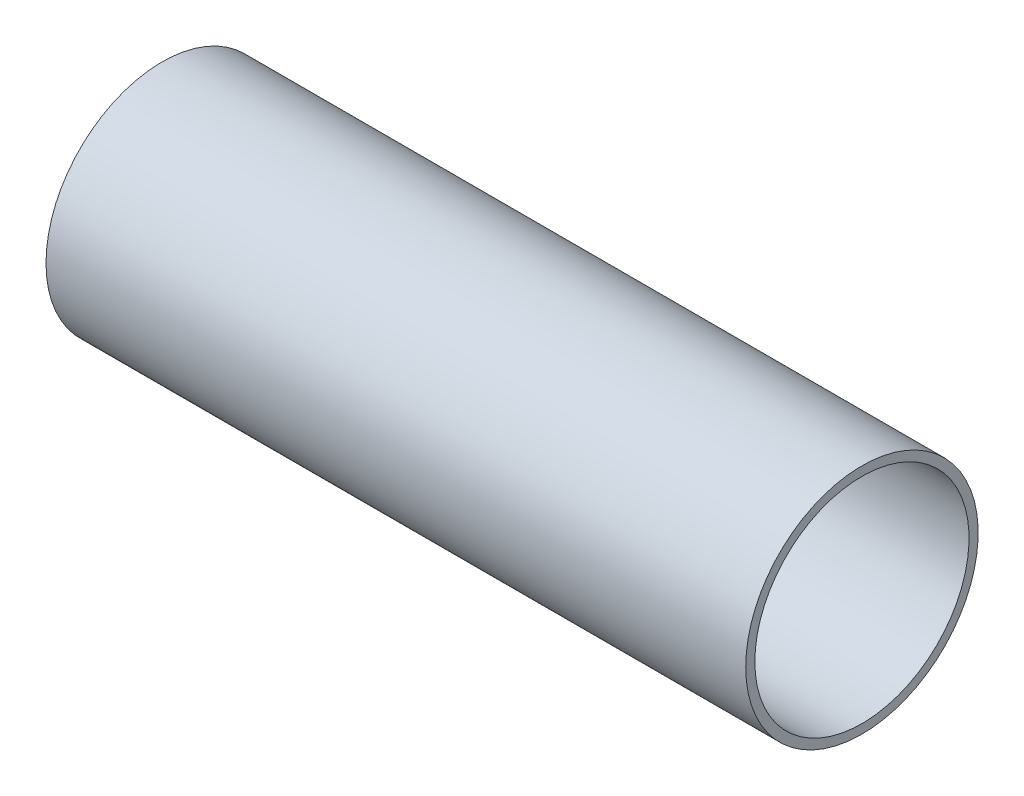
ISO-10303-21;
HEADER;
FILE_DESCRIPTION(('STEP AP214'),'2;1');
FILE_NAME('part.step','',(''),(''),'','','');
FILE_SCHEMA(('AUTOMOTIVE_DESIGN { 1 0 10303 214 1 1 1 1 }'));
ENDSEC;
DATA;
#1=APPLICATION_CONTEXT('core data for automotive mechanical design processes');
#2=APPLICATION_PROTOCOL_DEFINITION('international standard','automotive_design',2000,#1);
#3=PRODUCT_CONTEXT('',#1,'mechanical');
#4=PRODUCT('Part','Part','',(#3));
#5=PRODUCT_RELATED_PRODUCT_CATEGORY('part','',(#4));
#6=PRODUCT_DEFINITION_FORMATION('','',#4);
#7=PRODUCT_DEFINITION_CONTEXT('part definition',#1,'design');
#8=PRODUCT_DEFINITION('design','',#6,#7);
#9=PRODUCT_DEFINITION_SHAPE('','',#8);
#10=(LENGTH_UNIT() NAMED_UNIT(*) SI_UNIT(.MILLI.,.METRE.));
#11=(NAMED_UNIT(*) PLANE_ANGLE_UNIT() SI_UNIT($,.RADIAN.));
#12=(NAMED_UNIT(*) SI_UNIT($,.STERADIAN.) SOLID_ANGLE_UNIT());
#13=UNCERTAINTY_MEASURE_WITH_UNIT(LENGTH_MEASURE(1.E-05),#10,'distance_accuracy_value','');
#14=(GEOMETRIC_REPRESENTATION_CONTEXT(3) GLOBAL_UNCERTAINTY_ASSIGNED_CONTEXT((#13)) GLOBAL_UNIT_ASSIGNED_CONTEXT((#10,
#11,#12)) REPRESENTATION_CONTEXT('',''));
#15=CARTESIAN_POINT('',(0.,0.,0.));
#16=DIRECTION('',(0.,0.,1.));
#17=DIRECTION('',(1.,0.,0.));
#18=AXIS2_PLACEMENT_3D('',#15,#16,#17);
#19=CARTESIAN_POINT('',(-72.8939918967907,0.,0.));
#20=DIRECTION('',(-1.,0.,0.));
#21=DIRECTION('',(0.,0.,1.));
#22=AXIS2_PLACEMENT_3D('',#19,#20,#21);
#23=CYLINDRICAL_SURFACE('',#22,15.875);
#24=CARTESIAN_POINT('',(-47.7901,0.,0.));
#25=DIRECTION('',(-1.,0.,0.));
#26=DIRECTION('',(0.,0.,1.));
#27=AXIS2_PLACEMENT_3D('',#24,#25,#26);
#28=CIRCLE('',#27,15.875);
#29=CARTESIAN_POINT('',(-47.7901,0.,15.875));
#30=VERTEX_POINT('',#29);
#31=EDGE_CURVE('E46',#30,#30,#28,.T.);
#32=ORIENTED_EDGE('',*,*,#31,.F.);
#33=EDGE_LOOP('',(#32));
#34=FACE_BOUND('',#33,.T.);
#35=CARTESIAN_POINT('',(47.7901,0.,0.));
#36=DIRECTION('',(-1.,0.,0.));
#37=DIRECTION('',(0.,0.,1.));
#38=AXIS2_PLACEMENT_3D('',#35,#36,#37);
#39=CIRCLE('',#38,15.875);
#40=CARTESIAN_POINT('',(47.7901,0.,15.875));
#41=VERTEX_POINT('',#40);
#42=EDGE_CURVE('E10',#41,#41,#39,.T.);
#43=ORIENTED_EDGE('',*,*,#42,.T.);
#44=EDGE_LOOP('',(#43));
#45=FACE_BOUND('',#44,.T.);
#46=ADVANCED_FACE('F32',(#34,#45),#23,.T.);
#47=CARTESIAN_POINT('',(47.7901,0.,-15.875));
#48=DIRECTION('',(-1.,0.,0.));
#49=DIRECTION('',(0.,0.,1.));
#50=AXIS2_PLACEMENT_3D('',#47,#48,#49);
#51=PLANE('',#50);
#52=ORIENTED_EDGE('',*,*,#42,.F.);
#53=EDGE_LOOP('',(#52));
#54=FACE_BOUND('',#53,.T.);
#55=CARTESIAN_POINT('',(47.7901,0.,0.));
#56=DIRECTION('',(-1.,0.,0.));
#57=DIRECTION('',(0.,0.,1.));
#58=AXIS2_PLACEMENT_3D('',#55,#56,#57);
#59=CIRCLE('',#58,14.6304);
#60=CARTESIAN_POINT('',(47.7901,0.,14.6304));
#61=VERTEX_POINT('',#60);
#62=EDGE_CURVE('E38',#61,#61,#59,.T.);
#63=ORIENTED_EDGE('',*,*,#62,.T.);
#64=EDGE_LOOP('',(#63));
#65=FACE_BOUND('',#64,.T.);
#66=ADVANCED_FACE('F55',(#54,#65),#51,.F.);
#67=CARTESIAN_POINT('',(-72.8939918967907,0.,0.));
#68=DIRECTION('',(-1.,0.,0.));
#69=DIRECTION('',(0.,0.,1.));
#70=AXIS2_PLACEMENT_3D('',#67,#68,#69);
#71=CYLINDRICAL_SURFACE('',#70,14.6304);
#72=ORIENTED_EDGE('',*,*,#62,.F.);
#73=EDGE_LOOP('',(#72));
#74=FACE_BOUND('',#73,.T.);
#75=CARTESIAN_POINT('',(-47.7901,0.,0.));
#76=DIRECTION('',(-1.,0.,0.));
#77=DIRECTION('',(0.,0.,1.));
#78=AXIS2_PLACEMENT_3D('',#75,#76,#77);
#79=CIRCLE('',#78,14.6304);
#80=CARTESIAN_POINT('',(-47.7901,0.,14.6304));
#81=VERTEX_POINT('',#80);
#82=EDGE_CURVE('E42',#81,#81,#79,.T.);
#83=ORIENTED_EDGE('',*,*,#82,.T.);
#84=EDGE_LOOP('',(#83));
#85=FACE_BOUND('',#84,.T.);
#86=ADVANCED_FACE('F59',(#74,#85),#71,.F.);
#87=CARTESIAN_POINT('',(-47.7901,0.,-15.875));
#88=DIRECTION('',(1.,0.,0.));
#89=DIRECTION('',(0.,0.,-1.));
#90=AXIS2_PLACEMENT_3D('',#87,#88,#89);
#91=PLANE('',#90);
#92=ORIENTED_EDGE('',*,*,#82,.F.);
#93=EDGE_LOOP('',(#92));
#94=FACE_BOUND('',#93,.T.);
#95=ORIENTED_EDGE('',*,*,#31,.T.);
#96=EDGE_LOOP('',(#95));
#97=FACE_BOUND('',#96,.T.);
#98=ADVANCED_FACE('F52',(#94,#97),#91,.F.);
#99=CLOSED_SHELL('',(#46,#66,#86,#98));
#100=MANIFOLD_SOLID_BREP('B2',#99);
#101=ADVANCED_BREP_SHAPE_REPRESENTATION('',(#18,#100),#14);
#102=SHAPE_DEFINITION_REPRESENTATION(#9,#101);
ENDSEC;
END-ISO-10303-21;
